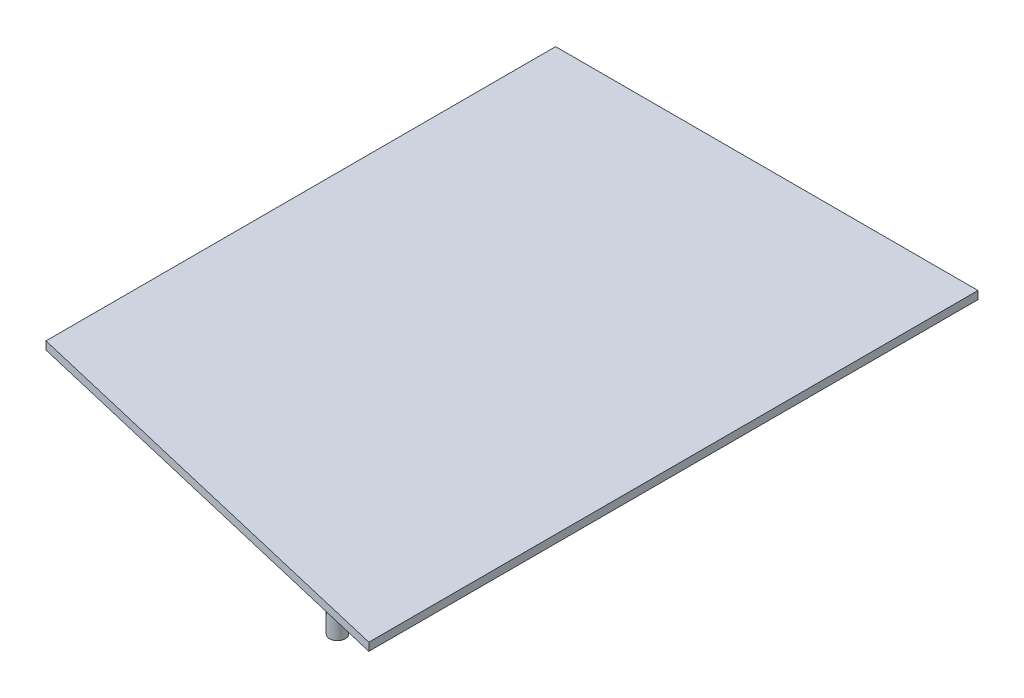
ISO-10303-21;
HEADER;
FILE_DESCRIPTION(('STEP AP214'),'2;1');
FILE_NAME('part.step','',(''),(''),'','','');
FILE_SCHEMA(('AUTOMOTIVE_DESIGN { 1 0 10303 214 1 1 1 1 }'));
ENDSEC;
DATA;
#1=APPLICATION_CONTEXT('core data for automotive mechanical design processes');
#2=APPLICATION_PROTOCOL_DEFINITION('international standard','automotive_design',2000,#1);
#3=PRODUCT_CONTEXT('',#1,'mechanical');
#4=PRODUCT('Part','Part','',(#3));
#5=PRODUCT_RELATED_PRODUCT_CATEGORY('part','',(#4));
#6=PRODUCT_DEFINITION_FORMATION('','',#4);
#7=PRODUCT_DEFINITION_CONTEXT('part definition',#1,'design');
#8=PRODUCT_DEFINITION('design','',#6,#7);
#9=PRODUCT_DEFINITION_SHAPE('','',#8);
#10=(LENGTH_UNIT() NAMED_UNIT(*) SI_UNIT(.MILLI.,.METRE.));
#11=(NAMED_UNIT(*) PLANE_ANGLE_UNIT() SI_UNIT($,.RADIAN.));
#12=(NAMED_UNIT(*) SI_UNIT($,.STERADIAN.) SOLID_ANGLE_UNIT());
#13=UNCERTAINTY_MEASURE_WITH_UNIT(LENGTH_MEASURE(1.E-05),#10,'distance_accuracy_value','');
#14=(GEOMETRIC_REPRESENTATION_CONTEXT(3) GLOBAL_UNCERTAINTY_ASSIGNED_CONTEXT((#13)) GLOBAL_UNIT_ASSIGNED_CONTEXT((#10,
#11,#12)) REPRESENTATION_CONTEXT('',''));
#15=CARTESIAN_POINT('',(0.,0.,0.));
#16=DIRECTION('',(0.,0.,1.));
#17=DIRECTION('',(1.,0.,0.));
#18=AXIS2_PLACEMENT_3D('',#15,#16,#17);
#19=CARTESIAN_POINT('',(0.,0.,0.));
#20=DIRECTION('',(0.,-1.,0.));
#21=DIRECTION('',(0.,0.,-1.));
#22=AXIS2_PLACEMENT_3D('',#19,#20,#21);
#23=PLANE('',#22);
#24=DIRECTION('',(1.,0.,0.));
#25=VECTOR('',#24,1.);
#26=CARTESIAN_POINT('',(5.,0.,-75.));
#27=LINE('',#26,#25);
#28=CARTESIAN_POINT('',(5.,0.,-75.));
#29=VERTEX_POINT('',#28);
#30=CARTESIAN_POINT('',(61.3,0.,-75.));
#31=VERTEX_POINT('',#30);
#32=EDGE_CURVE('E48',#29,#31,#27,.T.);
#33=ORIENTED_EDGE('',*,*,#32,.F.);
#34=DIRECTION('',(0.,0.,-1.));
#35=VECTOR('',#34,1.);
#36=CARTESIAN_POINT('',(5.,0.,-3.95869031925986));
#37=LINE('',#36,#35);
#38=CARTESIAN_POINT('',(5.,0.,-3.95869031925986));
#39=VERTEX_POINT('',#38);
#40=EDGE_CURVE('E167',#39,#29,#37,.T.);
#41=ORIENTED_EDGE('',*,*,#40,.F.);
#42=DIRECTION('',(-0.973339240620554,0.,-0.229370274159935));
#43=VECTOR('',#42,1.);
#44=CARTESIAN_POINT('',(61.3,0.,9.30857138794438));
#45=LINE('',#44,#43);
#46=CARTESIAN_POINT('',(61.3,0.,9.30857138794438));
#47=VERTEX_POINT('',#46);
#48=EDGE_CURVE('E170',#47,#39,#45,.T.);
#49=ORIENTED_EDGE('',*,*,#48,.F.);
#50=DIRECTION('',(0.,0.,1.));
#51=VECTOR('',#50,1.);
#52=CARTESIAN_POINT('',(61.3,0.,-75.));
#53=LINE('',#52,#51);
#54=EDGE_CURVE('E176',#31,#47,#53,.T.);
#55=ORIENTED_EDGE('',*,*,#54,.F.);
#56=EDGE_LOOP('',(#33,#41,#49,#55));
#57=FACE_BOUND('',#56,.T.);
#58=CARTESIAN_POINT('',(56.5,0.,10.7459147371557));
#59=DIRECTION('',(0.,-1.,0.));
#60=DIRECTION('',(0.,0.,-1.));
#61=AXIS2_PLACEMENT_3D('',#58,#59,#60);
#62=CIRCLE('',#61,1.25);
#63=CARTESIAN_POINT('',(56.5,0.,9.49591473715566));
#64=VERTEX_POINT('',#63);
#65=EDGE_CURVE('E241',#64,#64,#62,.T.);
#66=ORIENTED_EDGE('',*,*,#65,.F.);
#67=EDGE_LOOP('',(#66));
#68=FACE_BOUND('',#67,.T.);
#69=DIRECTION('',(0.973339240620554,0.,0.229370274159935));
#70=VECTOR('',#69,1.);
#71=CARTESIAN_POINT('',(66.3,0.,15.6237913177201));
#72=LINE('',#71,#70);
#73=CARTESIAN_POINT('',(0.,0.,0.));
#74=VERTEX_POINT('',#73);
#75=CARTESIAN_POINT('',(66.3,0.,15.6237913177201));
#76=VERTEX_POINT('',#75);
#77=EDGE_CURVE('E245',#74,#76,#72,.T.);
#78=ORIENTED_EDGE('',*,*,#77,.F.);
#79=DIRECTION('',(0.,0.,1.));
#80=VECTOR('',#79,1.);
#81=CARTESIAN_POINT('',(0.,0.,0.));
#82=LINE('',#81,#80);
#83=CARTESIAN_POINT('',(0.,0.,-80.));
#84=VERTEX_POINT('',#83);
#85=EDGE_CURVE('E252',#84,#74,#82,.T.);
#86=ORIENTED_EDGE('',*,*,#85,.F.);
#87=DIRECTION('',(-1.,0.,0.));
#88=VECTOR('',#87,1.);
#89=CARTESIAN_POINT('',(0.,0.,-80.));
#90=LINE('',#89,#88);
#91=CARTESIAN_POINT('',(66.3,0.,-80.));
#92=VERTEX_POINT('',#91);
#93=EDGE_CURVE('E263',#92,#84,#90,.T.);
#94=ORIENTED_EDGE('',*,*,#93,.F.);
#95=DIRECTION('',(0.,0.,-1.));
#96=VECTOR('',#95,1.);
#97=CARTESIAN_POINT('',(66.3,0.,-80.));
#98=LINE('',#97,#96);
#99=EDGE_CURVE('E261',#76,#92,#98,.T.);
#100=ORIENTED_EDGE('',*,*,#99,.F.);
#101=EDGE_LOOP('',(#78,#86,#94,#100));
#102=FACE_BOUND('',#101,.T.);
#103=DIRECTION('',(-1.,0.,0.));
#104=VECTOR('',#103,1.);
#105=CARTESIAN_POINT('',(57.75,0.,-76.25));
#106=LINE('',#105,#104);
#107=CARTESIAN_POINT('',(57.75,0.,-76.25));
#108=VERTEX_POINT('',#107);
#109=CARTESIAN_POINT('',(55.25,0.,-76.25));
#110=VERTEX_POINT('',#109);
#111=EDGE_CURVE('E226',#108,#110,#106,.T.);
#112=ORIENTED_EDGE('',*,*,#111,.F.);
#113=DIRECTION('',(0.,0.,1.));
#114=VECTOR('',#113,1.);
#115=CARTESIAN_POINT('',(57.75,0.,-78.75));
#116=LINE('',#115,#114);
#117=CARTESIAN_POINT('',(57.75,0.,-78.75));
#118=VERTEX_POINT('',#117);
#119=EDGE_CURVE('E212',#118,#108,#116,.T.);
#120=ORIENTED_EDGE('',*,*,#119,.F.);
#121=DIRECTION('',(1.,0.,0.));
#122=VECTOR('',#121,1.);
#123=CARTESIAN_POINT('',(57.75,0.,-78.75));
#124=LINE('',#123,#122);
#125=CARTESIAN_POINT('',(55.25,0.,-78.75));
#126=VERTEX_POINT('',#125);
#127=EDGE_CURVE('E217',#126,#118,#124,.T.);
#128=ORIENTED_EDGE('',*,*,#127,.F.);
#129=DIRECTION('',(0.,0.,-1.));
#130=VECTOR('',#129,1.);
#131=CARTESIAN_POINT('',(55.25,0.,-78.75));
#132=LINE('',#131,#130);
#133=EDGE_CURVE('E228',#110,#126,#132,.T.);
#134=ORIENTED_EDGE('',*,*,#133,.F.);
#135=EDGE_LOOP('',(#112,#120,#128,#134));
#136=FACE_BOUND('',#135,.T.);
#137=DIRECTION('',(-1.,0.,0.));
#138=VECTOR('',#137,1.);
#139=CARTESIAN_POINT('',(3.75,0.,-23.75));
#140=LINE('',#139,#138);
#141=CARTESIAN_POINT('',(3.75,0.,-23.75));
#142=VERTEX_POINT('',#141);
#143=CARTESIAN_POINT('',(1.25,0.,-23.75));
#144=VERTEX_POINT('',#143);
#145=EDGE_CURVE('E199',#142,#144,#140,.T.);
#146=ORIENTED_EDGE('',*,*,#145,.F.);
#147=DIRECTION('',(0.,0.,1.));
#148=VECTOR('',#147,1.);
#149=CARTESIAN_POINT('',(3.75,0.,-26.25));
#150=LINE('',#149,#148);
#151=CARTESIAN_POINT('',(3.75,0.,-26.25));
#152=VERTEX_POINT('',#151);
#153=EDGE_CURVE('E182',#152,#142,#150,.T.);
#154=ORIENTED_EDGE('',*,*,#153,.F.);
#155=DIRECTION('',(1.,0.,0.));
#156=VECTOR('',#155,1.);
#157=CARTESIAN_POINT('',(3.75,0.,-26.25));
#158=LINE('',#157,#156);
#159=CARTESIAN_POINT('',(1.25,0.,-26.25));
#160=VERTEX_POINT('',#159);
#161=EDGE_CURVE('E190',#160,#152,#158,.T.);
#162=ORIENTED_EDGE('',*,*,#161,.F.);
#163=DIRECTION('',(0.,0.,-1.));
#164=VECTOR('',#163,1.);
#165=CARTESIAN_POINT('',(1.25,0.,-26.25));
#166=LINE('',#165,#164);
#167=EDGE_CURVE('E201',#144,#160,#166,.T.);
#168=ORIENTED_EDGE('',*,*,#167,.F.);
#169=EDGE_LOOP('',(#146,#154,#162,#168));
#170=FACE_BOUND('',#169,.T.);
#171=ADVANCED_FACE('F33',(#57,#68,#102,#136,#170),#23,.T.);
#172=CARTESIAN_POINT('',(66.3,1.25,15.6237913177201));
#173=DIRECTION('',(0.229370274159935,0.,-0.973339240620554));
#174=DIRECTION('',(-0.973339240620554,0.,-0.229370274159935));
#175=AXIS2_PLACEMENT_3D('',#172,#173,#174);
#176=PLANE('',#175);
#177=ORIENTED_EDGE('',*,*,#77,.T.);
#178=DIRECTION('',(0.,-1.,0.));
#179=VECTOR('',#178,1.);
#180=CARTESIAN_POINT('',(66.3,1.25,15.6237913177201));
#181=LINE('',#180,#179);
#182=CARTESIAN_POINT('',(66.3,1.25,15.6237913177201));
#183=VERTEX_POINT('',#182);
#184=EDGE_CURVE('E11',#183,#76,#181,.T.);
#185=ORIENTED_EDGE('',*,*,#184,.F.);
#186=DIRECTION('',(0.973339240620554,0.,0.229370274159935));
#187=VECTOR('',#186,1.);
#188=CARTESIAN_POINT('',(66.3,1.25,15.6237913177201));
#189=LINE('',#188,#187);
#190=CARTESIAN_POINT('',(0.,1.25,0.));
#191=VERTEX_POINT('',#190);
#192=EDGE_CURVE('E248',#191,#183,#189,.T.);
#193=ORIENTED_EDGE('',*,*,#192,.F.);
#194=DIRECTION('',(0.,-1.,0.));
#195=VECTOR('',#194,1.);
#196=CARTESIAN_POINT('',(0.,1.25,0.));
#197=LINE('',#196,#195);
#198=EDGE_CURVE('E258',#191,#74,#197,.T.);
#199=ORIENTED_EDGE('',*,*,#198,.T.);
#200=EDGE_LOOP('',(#177,#185,#193,#199));
#201=FACE_BOUND('',#200,.T.);
#202=ADVANCED_FACE('F35',(#201),#176,.F.);
#203=CARTESIAN_POINT('',(66.3,1.25,-80.));
#204=DIRECTION('',(-1.,0.,0.));
#205=DIRECTION('',(0.,0.,1.));
#206=AXIS2_PLACEMENT_3D('',#203,#204,#205);
#207=PLANE('',#206);
#208=ORIENTED_EDGE('',*,*,#99,.T.);
#209=DIRECTION('',(0.,-1.,0.));
#210=VECTOR('',#209,1.);
#211=CARTESIAN_POINT('',(66.3,1.25,-80.));
#212=LINE('',#211,#210);
#213=CARTESIAN_POINT('',(66.3,1.25,-80.));
#214=VERTEX_POINT('',#213);
#215=EDGE_CURVE('E41',#214,#92,#212,.T.);
#216=ORIENTED_EDGE('',*,*,#215,.F.);
#217=DIRECTION('',(0.,0.,-1.));
#218=VECTOR('',#217,1.);
#219=CARTESIAN_POINT('',(66.3,1.25,-80.));
#220=LINE('',#219,#218);
#221=EDGE_CURVE('E251',#183,#214,#220,.T.);
#222=ORIENTED_EDGE('',*,*,#221,.F.);
#223=ORIENTED_EDGE('',*,*,#184,.T.);
#224=EDGE_LOOP('',(#208,#216,#222,#223));
#225=FACE_BOUND('',#224,.T.);
#226=ADVANCED_FACE('F291',(#225),#207,.F.);
#227=CARTESIAN_POINT('',(0.,1.25,-80.));
#228=DIRECTION('',(0.,0.,1.));
#229=DIRECTION('',(1.,0.,0.));
#230=AXIS2_PLACEMENT_3D('',#227,#228,#229);
#231=PLANE('',#230);
#232=ORIENTED_EDGE('',*,*,#93,.T.);
#233=DIRECTION('',(0.,-1.,0.));
#234=VECTOR('',#233,1.);
#235=CARTESIAN_POINT('',(0.,1.25,-80.));
#236=LINE('',#235,#234);
#237=CARTESIAN_POINT('',(0.,1.25,-80.));
#238=VERTEX_POINT('',#237);
#239=EDGE_CURVE('E268',#238,#84,#236,.T.);
#240=ORIENTED_EDGE('',*,*,#239,.F.);
#241=DIRECTION('',(-1.,0.,0.));
#242=VECTOR('',#241,1.);
#243=CARTESIAN_POINT('',(0.,1.25,-80.));
#244=LINE('',#243,#242);
#245=EDGE_CURVE('E254',#214,#238,#244,.T.);
#246=ORIENTED_EDGE('',*,*,#245,.F.);
#247=ORIENTED_EDGE('',*,*,#215,.T.);
#248=EDGE_LOOP('',(#232,#240,#246,#247));
#249=FACE_BOUND('',#248,.T.);
#250=ADVANCED_FACE('F275',(#249),#231,.F.);
#251=CARTESIAN_POINT('',(0.,1.25,0.));
#252=DIRECTION('',(1.,0.,0.));
#253=DIRECTION('',(0.,0.,-1.));
#254=AXIS2_PLACEMENT_3D('',#251,#252,#253);
#255=PLANE('',#254);
#256=ORIENTED_EDGE('',*,*,#85,.T.);
#257=ORIENTED_EDGE('',*,*,#198,.F.);
#258=DIRECTION('',(0.,0.,1.));
#259=VECTOR('',#258,1.);
#260=CARTESIAN_POINT('',(0.,1.25,0.));
#261=LINE('',#260,#259);
#262=EDGE_CURVE('E256',#238,#191,#261,.T.);
#263=ORIENTED_EDGE('',*,*,#262,.F.);
#264=ORIENTED_EDGE('',*,*,#239,.T.);
#265=EDGE_LOOP('',(#256,#257,#263,#264));
#266=FACE_BOUND('',#265,.T.);
#267=ADVANCED_FACE('F284',(#266),#255,.F.);
#268=CARTESIAN_POINT('',(0.,1.25,0.));
#269=DIRECTION('',(0.,-1.,0.));
#270=DIRECTION('',(0.,0.,-1.));
#271=AXIS2_PLACEMENT_3D('',#268,#269,#270);
#272=PLANE('',#271);
#273=ORIENTED_EDGE('',*,*,#192,.T.);
#274=ORIENTED_EDGE('',*,*,#221,.T.);
#275=ORIENTED_EDGE('',*,*,#245,.T.);
#276=ORIENTED_EDGE('',*,*,#262,.T.);
#277=EDGE_LOOP('',(#273,#274,#275,#276));
#278=FACE_BOUND('',#277,.T.);
#279=ADVANCED_FACE('F290',(#278),#272,.F.);
#280=CARTESIAN_POINT('',(56.5,-5.,10.7459147371557));
#281=DIRECTION('',(0.,1.,0.));
#282=DIRECTION('',(0.,0.,1.));
#283=AXIS2_PLACEMENT_3D('',#280,#281,#282);
#284=CYLINDRICAL_SURFACE('',#283,1.25);
#285=CARTESIAN_POINT('',(56.5,-5.,10.7459147371557));
#286=DIRECTION('',(0.,-1.,0.));
#287=DIRECTION('',(0.,0.,-1.));
#288=AXIS2_PLACEMENT_3D('',#285,#286,#287);
#289=CIRCLE('',#288,1.25);
#290=CARTESIAN_POINT('',(56.5,-5.,9.49591473715566));
#291=VERTEX_POINT('',#290);
#292=EDGE_CURVE('E242',#291,#291,#289,.T.);
#293=ORIENTED_EDGE('',*,*,#292,.F.);
#294=EDGE_LOOP('',(#293));
#295=FACE_BOUND('',#294,.T.);
#296=ORIENTED_EDGE('',*,*,#65,.T.);
#297=EDGE_LOOP('',(#296));
#298=FACE_BOUND('',#297,.T.);
#299=ADVANCED_FACE('F311',(#295,#298),#284,.T.);
#300=CARTESIAN_POINT('',(56.5,-5.,10.7459147371557));
#301=DIRECTION('',(0.,-1.,0.));
#302=DIRECTION('',(0.,0.,-1.));
#303=AXIS2_PLACEMENT_3D('',#300,#301,#302);
#304=PLANE('',#303);
#305=ORIENTED_EDGE('',*,*,#292,.T.);
#306=EDGE_LOOP('',(#305));
#307=FACE_BOUND('',#306,.T.);
#308=ADVANCED_FACE('F315',(#307),#304,.T.);
#309=CARTESIAN_POINT('',(57.75,-5.,-78.75));
#310=DIRECTION('',(-1.,0.,0.));
#311=DIRECTION('',(0.,0.,1.));
#312=AXIS2_PLACEMENT_3D('',#309,#310,#311);
#313=PLANE('',#312);
#314=ORIENTED_EDGE('',*,*,#119,.T.);
#315=DIRECTION('',(0.,1.,0.));
#316=VECTOR('',#315,1.);
#317=CARTESIAN_POINT('',(57.75,-5.,-76.25));
#318=LINE('',#317,#316);
#319=CARTESIAN_POINT('',(57.75,-5.,-76.25));
#320=VERTEX_POINT('',#319);
#321=EDGE_CURVE('E239',#320,#108,#318,.T.);
#322=ORIENTED_EDGE('',*,*,#321,.F.);
#323=DIRECTION('',(0.,0.,1.));
#324=VECTOR('',#323,1.);
#325=CARTESIAN_POINT('',(57.75,-5.,-78.75));
#326=LINE('',#325,#324);
#327=CARTESIAN_POINT('',(57.75,-5.,-78.75));
#328=VERTEX_POINT('',#327);
#329=EDGE_CURVE('E213',#328,#320,#326,.T.);
#330=ORIENTED_EDGE('',*,*,#329,.F.);
#331=DIRECTION('',(0.,1.,0.));
#332=VECTOR('',#331,1.);
#333=CARTESIAN_POINT('',(57.75,-5.,-78.75));
#334=LINE('',#333,#332);
#335=EDGE_CURVE('E223',#328,#118,#334,.T.);
#336=ORIENTED_EDGE('',*,*,#335,.T.);
#337=EDGE_LOOP('',(#314,#322,#330,#336));
#338=FACE_BOUND('',#337,.T.);
#339=ADVANCED_FACE('F320',(#338),#313,.F.);
#340=CARTESIAN_POINT('',(57.75,-5.,-76.25));
#341=DIRECTION('',(0.,0.,-1.));
#342=DIRECTION('',(-1.,0.,0.));
#343=AXIS2_PLACEMENT_3D('',#340,#341,#342);
#344=PLANE('',#343);
#345=ORIENTED_EDGE('',*,*,#111,.T.);
#346=DIRECTION('',(0.,1.,0.));
#347=VECTOR('',#346,1.);
#348=CARTESIAN_POINT('',(55.25,-5.,-76.25));
#349=LINE('',#348,#347);
#350=CARTESIAN_POINT('',(55.25,-5.,-76.25));
#351=VERTEX_POINT('',#350);
#352=EDGE_CURVE('E236',#351,#110,#349,.T.);
#353=ORIENTED_EDGE('',*,*,#352,.F.);
#354=DIRECTION('',(-1.,0.,0.));
#355=VECTOR('',#354,1.);
#356=CARTESIAN_POINT('',(57.75,-5.,-76.25));
#357=LINE('',#356,#355);
#358=EDGE_CURVE('E216',#320,#351,#357,.T.);
#359=ORIENTED_EDGE('',*,*,#358,.F.);
#360=ORIENTED_EDGE('',*,*,#321,.T.);
#361=EDGE_LOOP('',(#345,#353,#359,#360));
#362=FACE_BOUND('',#361,.T.);
#363=ADVANCED_FACE('F328',(#362),#344,.F.);
#364=CARTESIAN_POINT('',(55.25,-5.,-78.75));
#365=DIRECTION('',(1.,0.,0.));
#366=DIRECTION('',(0.,0.,-1.));
#367=AXIS2_PLACEMENT_3D('',#364,#365,#366);
#368=PLANE('',#367);
#369=ORIENTED_EDGE('',*,*,#133,.T.);
#370=DIRECTION('',(0.,1.,0.));
#371=VECTOR('',#370,1.);
#372=CARTESIAN_POINT('',(55.25,-5.,-78.75));
#373=LINE('',#372,#371);
#374=CARTESIAN_POINT('',(55.25,-5.,-78.75));
#375=VERTEX_POINT('',#374);
#376=EDGE_CURVE('E234',#375,#126,#373,.T.);
#377=ORIENTED_EDGE('',*,*,#376,.F.);
#378=DIRECTION('',(0.,0.,-1.));
#379=VECTOR('',#378,1.);
#380=CARTESIAN_POINT('',(55.25,-5.,-78.75));
#381=LINE('',#380,#379);
#382=EDGE_CURVE('E219',#351,#375,#381,.T.);
#383=ORIENTED_EDGE('',*,*,#382,.F.);
#384=ORIENTED_EDGE('',*,*,#352,.T.);
#385=EDGE_LOOP('',(#369,#377,#383,#384));
#386=FACE_BOUND('',#385,.T.);
#387=ADVANCED_FACE('F332',(#386),#368,.F.);
#388=CARTESIAN_POINT('',(57.75,-5.,-78.75));
#389=DIRECTION('',(0.,0.,1.));
#390=DIRECTION('',(1.,0.,0.));
#391=AXIS2_PLACEMENT_3D('',#388,#389,#390);
#392=PLANE('',#391);
#393=ORIENTED_EDGE('',*,*,#127,.T.);
#394=ORIENTED_EDGE('',*,*,#335,.F.);
#395=DIRECTION('',(1.,0.,0.));
#396=VECTOR('',#395,1.);
#397=CARTESIAN_POINT('',(57.75,-5.,-78.75));
#398=LINE('',#397,#396);
#399=EDGE_CURVE('E221',#375,#328,#398,.T.);
#400=ORIENTED_EDGE('',*,*,#399,.F.);
#401=ORIENTED_EDGE('',*,*,#376,.T.);
#402=EDGE_LOOP('',(#393,#394,#400,#401));
#403=FACE_BOUND('',#402,.T.);
#404=ADVANCED_FACE('F336',(#403),#392,.F.);
#405=CARTESIAN_POINT('',(0.,-5.,0.));
#406=DIRECTION('',(0.,-1.,0.));
#407=DIRECTION('',(0.,0.,-1.));
#408=AXIS2_PLACEMENT_3D('',#405,#406,#407);
#409=PLANE('',#408);
#410=ORIENTED_EDGE('',*,*,#329,.T.);
#411=ORIENTED_EDGE('',*,*,#358,.T.);
#412=ORIENTED_EDGE('',*,*,#382,.T.);
#413=ORIENTED_EDGE('',*,*,#399,.T.);
#414=EDGE_LOOP('',(#410,#411,#412,#413));
#415=FACE_BOUND('',#414,.T.);
#416=ADVANCED_FACE('F340',(#415),#409,.T.);
#417=CARTESIAN_POINT('',(3.75,-5.,-26.25));
#418=DIRECTION('',(-1.,0.,0.));
#419=DIRECTION('',(0.,0.,1.));
#420=AXIS2_PLACEMENT_3D('',#417,#418,#419);
#421=PLANE('',#420);
#422=ORIENTED_EDGE('',*,*,#153,.T.);
#423=DIRECTION('',(0.,1.,0.));
#424=VECTOR('',#423,1.);
#425=CARTESIAN_POINT('',(3.75,-5.,-23.75));
#426=LINE('',#425,#424);
#427=CARTESIAN_POINT('',(3.75,-5.,-23.75));
#428=VERTEX_POINT('',#427);
#429=EDGE_CURVE('E210',#428,#142,#426,.T.);
#430=ORIENTED_EDGE('',*,*,#429,.F.);
#431=DIRECTION('',(0.,0.,1.));
#432=VECTOR('',#431,1.);
#433=CARTESIAN_POINT('',(3.75,-5.,-26.25));
#434=LINE('',#433,#432);
#435=CARTESIAN_POINT('',(3.75,-5.,-26.25));
#436=VERTEX_POINT('',#435);
#437=EDGE_CURVE('E186',#436,#428,#434,.T.);
#438=ORIENTED_EDGE('',*,*,#437,.F.);
#439=DIRECTION('',(0.,1.,0.));
#440=VECTOR('',#439,1.);
#441=CARTESIAN_POINT('',(3.75,-5.,-26.25));
#442=LINE('',#441,#440);
#443=EDGE_CURVE('E196',#436,#152,#442,.T.);
#444=ORIENTED_EDGE('',*,*,#443,.T.);
#445=EDGE_LOOP('',(#422,#430,#438,#444));
#446=FACE_BOUND('',#445,.T.);
#447=ADVANCED_FACE('F344',(#446),#421,.F.);
#448=CARTESIAN_POINT('',(3.75,-5.,-23.75));
#449=DIRECTION('',(0.,0.,-1.));
#450=DIRECTION('',(-1.,0.,0.));
#451=AXIS2_PLACEMENT_3D('',#448,#449,#450);
#452=PLANE('',#451);
#453=ORIENTED_EDGE('',*,*,#145,.T.);
#454=DIRECTION('',(0.,1.,0.));
#455=VECTOR('',#454,1.);
#456=CARTESIAN_POINT('',(1.25,-5.,-23.75));
#457=LINE('',#456,#455);
#458=CARTESIAN_POINT('',(1.25,-5.,-23.75));
#459=VERTEX_POINT('',#458);
#460=EDGE_CURVE('E207',#459,#144,#457,.T.);
#461=ORIENTED_EDGE('',*,*,#460,.F.);
#462=DIRECTION('',(-1.,0.,0.));
#463=VECTOR('',#462,1.);
#464=CARTESIAN_POINT('',(3.75,-5.,-23.75));
#465=LINE('',#464,#463);
#466=EDGE_CURVE('E189',#428,#459,#465,.T.);
#467=ORIENTED_EDGE('',*,*,#466,.F.);
#468=ORIENTED_EDGE('',*,*,#429,.T.);
#469=EDGE_LOOP('',(#453,#461,#467,#468));
#470=FACE_BOUND('',#469,.T.);
#471=ADVANCED_FACE('F348',(#470),#452,.F.);
#472=CARTESIAN_POINT('',(1.25,-5.,-26.25));
#473=DIRECTION('',(1.,0.,0.));
#474=DIRECTION('',(0.,0.,-1.));
#475=AXIS2_PLACEMENT_3D('',#472,#473,#474);
#476=PLANE('',#475);
#477=ORIENTED_EDGE('',*,*,#167,.T.);
#478=DIRECTION('',(0.,1.,0.));
#479=VECTOR('',#478,1.);
#480=CARTESIAN_POINT('',(1.25,-5.,-26.25));
#481=LINE('',#480,#479);
#482=CARTESIAN_POINT('',(1.25,-5.,-26.25));
#483=VERTEX_POINT('',#482);
#484=EDGE_CURVE('E56',#483,#160,#481,.T.);
#485=ORIENTED_EDGE('',*,*,#484,.F.);
#486=DIRECTION('',(0.,0.,-1.));
#487=VECTOR('',#486,1.);
#488=CARTESIAN_POINT('',(1.25,-5.,-26.25));
#489=LINE('',#488,#487);
#490=EDGE_CURVE('E192',#459,#483,#489,.T.);
#491=ORIENTED_EDGE('',*,*,#490,.F.);
#492=ORIENTED_EDGE('',*,*,#460,.T.);
#493=EDGE_LOOP('',(#477,#485,#491,#492));
#494=FACE_BOUND('',#493,.T.);
#495=ADVANCED_FACE('F352',(#494),#476,.F.);
#496=CARTESIAN_POINT('',(3.75,-5.,-26.25));
#497=DIRECTION('',(0.,0.,1.));
#498=DIRECTION('',(1.,0.,0.));
#499=AXIS2_PLACEMENT_3D('',#496,#497,#498);
#500=PLANE('',#499);
#501=ORIENTED_EDGE('',*,*,#161,.T.);
#502=ORIENTED_EDGE('',*,*,#443,.F.);
#503=DIRECTION('',(1.,0.,0.));
#504=VECTOR('',#503,1.);
#505=CARTESIAN_POINT('',(3.75,-5.,-26.25));
#506=LINE('',#505,#504);
#507=EDGE_CURVE('E194',#483,#436,#506,.T.);
#508=ORIENTED_EDGE('',*,*,#507,.F.);
#509=ORIENTED_EDGE('',*,*,#484,.T.);
#510=EDGE_LOOP('',(#501,#502,#508,#509));
#511=FACE_BOUND('',#510,.T.);
#512=ADVANCED_FACE('F356',(#511),#500,.F.);
#513=CARTESIAN_POINT('',(0.,-5.,0.));
#514=DIRECTION('',(0.,-1.,0.));
#515=DIRECTION('',(0.,0.,-1.));
#516=AXIS2_PLACEMENT_3D('',#513,#514,#515);
#517=PLANE('',#516);
#518=ORIENTED_EDGE('',*,*,#437,.T.);
#519=ORIENTED_EDGE('',*,*,#466,.T.);
#520=ORIENTED_EDGE('',*,*,#490,.T.);
#521=ORIENTED_EDGE('',*,*,#507,.T.);
#522=EDGE_LOOP('',(#518,#519,#520,#521));
#523=FACE_BOUND('',#522,.T.);
#524=ADVANCED_FACE('F360',(#523),#517,.T.);
#525=CARTESIAN_POINT('',(5.,0.6,-75.));
#526=DIRECTION('',(0.,0.,-1.));
#527=DIRECTION('',(-1.,0.,0.));
#528=AXIS2_PLACEMENT_3D('',#525,#526,#527);
#529=PLANE('',#528);
#530=ORIENTED_EDGE('',*,*,#32,.T.);
#531=DIRECTION('',(0.,-1.,0.));
#532=VECTOR('',#531,1.);
#533=CARTESIAN_POINT('',(61.3,0.6,-75.));
#534=LINE('',#533,#532);
#535=CARTESIAN_POINT('',(61.3,0.6,-75.));
#536=VERTEX_POINT('',#535);
#537=EDGE_CURVE('E145',#536,#31,#534,.T.);
#538=ORIENTED_EDGE('',*,*,#537,.F.);
#539=DIRECTION('',(1.,0.,0.));
#540=VECTOR('',#539,1.);
#541=CARTESIAN_POINT('',(5.,0.6,-75.));
#542=LINE('',#541,#540);
#543=CARTESIAN_POINT('',(5.,0.6,-75.));
#544=VERTEX_POINT('',#543);
#545=EDGE_CURVE('E149',#544,#536,#542,.T.);
#546=ORIENTED_EDGE('',*,*,#545,.F.);
#547=DIRECTION('',(0.,-1.,0.));
#548=VECTOR('',#547,1.);
#549=CARTESIAN_POINT('',(5.,0.6,-75.));
#550=LINE('',#549,#548);
#551=EDGE_CURVE('E180',#544,#29,#550,.T.);
#552=ORIENTED_EDGE('',*,*,#551,.T.);
#553=EDGE_LOOP('',(#530,#538,#546,#552));
#554=FACE_BOUND('',#553,.T.);
#555=ADVANCED_FACE('F147',(#554),#529,.F.);
#556=CARTESIAN_POINT('',(5.,0.6,-3.95869031925986));
#557=DIRECTION('',(-1.,0.,0.));
#558=DIRECTION('',(0.,0.,1.));
#559=AXIS2_PLACEMENT_3D('',#556,#557,#558);
#560=PLANE('',#559);
#561=ORIENTED_EDGE('',*,*,#40,.T.);
#562=ORIENTED_EDGE('',*,*,#551,.F.);
#563=DIRECTION('',(0.,0.,-1.));
#564=VECTOR('',#563,1.);
#565=CARTESIAN_POINT('',(5.,0.6,-3.95869031925986));
#566=LINE('',#565,#564);
#567=CARTESIAN_POINT('',(5.,0.6,-3.95869031925986));
#568=VERTEX_POINT('',#567);
#569=EDGE_CURVE('E155',#568,#544,#566,.T.);
#570=ORIENTED_EDGE('',*,*,#569,.F.);
#571=DIRECTION('',(0.,-1.,0.));
#572=VECTOR('',#571,1.);
#573=CARTESIAN_POINT('',(5.,0.6,-3.95869031925986));
#574=LINE('',#573,#572);
#575=EDGE_CURVE('E183',#568,#39,#574,.T.);
#576=ORIENTED_EDGE('',*,*,#575,.T.);
#577=EDGE_LOOP('',(#561,#562,#570,#576));
#578=FACE_BOUND('',#577,.T.);
#579=ADVANCED_FACE('F366',(#578),#560,.F.);
#580=CARTESIAN_POINT('',(61.3,0.6,9.30857138794438));
#581=DIRECTION('',(-0.229370274159935,0.,0.973339240620554));
#582=DIRECTION('',(0.973339240620554,0.,0.229370274159935));
#583=AXIS2_PLACEMENT_3D('',#580,#581,#582);
#584=PLANE('',#583);
#585=ORIENTED_EDGE('',*,*,#48,.T.);
#586=ORIENTED_EDGE('',*,*,#575,.F.);
#587=DIRECTION('',(-0.973339240620554,0.,-0.229370274159935));
#588=VECTOR('',#587,1.);
#589=CARTESIAN_POINT('',(61.3,0.6,9.30857138794438));
#590=LINE('',#589,#588);
#591=CARTESIAN_POINT('',(61.3,0.6,9.30857138794438));
#592=VERTEX_POINT('',#591);
#593=EDGE_CURVE('E163',#592,#568,#590,.T.);
#594=ORIENTED_EDGE('',*,*,#593,.F.);
#595=DIRECTION('',(0.,-1.,0.));
#596=VECTOR('',#595,1.);
#597=CARTESIAN_POINT('',(61.3,0.6,9.30857138794438));
#598=LINE('',#597,#596);
#599=EDGE_CURVE('E154',#592,#47,#598,.T.);
#600=ORIENTED_EDGE('',*,*,#599,.T.);
#601=EDGE_LOOP('',(#585,#586,#594,#600));
#602=FACE_BOUND('',#601,.T.);
#603=ADVANCED_FACE('F369',(#602),#584,.F.);
#604=CARTESIAN_POINT('',(61.3,0.6,-75.));
#605=DIRECTION('',(1.,0.,0.));
#606=DIRECTION('',(0.,0.,-1.));
#607=AXIS2_PLACEMENT_3D('',#604,#605,#606);
#608=PLANE('',#607);
#609=ORIENTED_EDGE('',*,*,#54,.T.);
#610=ORIENTED_EDGE('',*,*,#599,.F.);
#611=DIRECTION('',(0.,0.,1.));
#612=VECTOR('',#611,1.);
#613=CARTESIAN_POINT('',(61.3,0.6,-75.));
#614=LINE('',#613,#612);
#615=EDGE_CURVE('E158',#536,#592,#614,.T.);
#616=ORIENTED_EDGE('',*,*,#615,.F.);
#617=ORIENTED_EDGE('',*,*,#537,.T.);
#618=EDGE_LOOP('',(#609,#610,#616,#617));
#619=FACE_BOUND('',#618,.T.);
#620=ADVANCED_FACE('F159',(#619),#608,.F.);
#621=CARTESIAN_POINT('',(0.,0.6,0.));
#622=DIRECTION('',(0.,-1.,0.));
#623=DIRECTION('',(0.,0.,-1.));
#624=AXIS2_PLACEMENT_3D('',#621,#622,#623);
#625=PLANE('',#624);
#626=ORIENTED_EDGE('',*,*,#545,.T.);
#627=ORIENTED_EDGE('',*,*,#615,.T.);
#628=ORIENTED_EDGE('',*,*,#593,.T.);
#629=ORIENTED_EDGE('',*,*,#569,.T.);
#630=EDGE_LOOP('',(#626,#627,#628,#629));
#631=FACE_BOUND('',#630,.T.);
#632=ADVANCED_FACE('F165',(#631),#625,.T.);
#633=CLOSED_SHELL('',(#171,#202,#226,#250,#267,#279,#299,#308,#339,#363,#387,#404,#416,#447,
#471,#495,#512,#524,#555,#579,#603,#620,#632));
#634=MANIFOLD_SOLID_BREP('B2',#633);
#635=ADVANCED_BREP_SHAPE_REPRESENTATION('',(#18,#634),#14);
#636=SHAPE_DEFINITION_REPRESENTATION(#9,#635);
ENDSEC;
END-ISO-10303-21;
